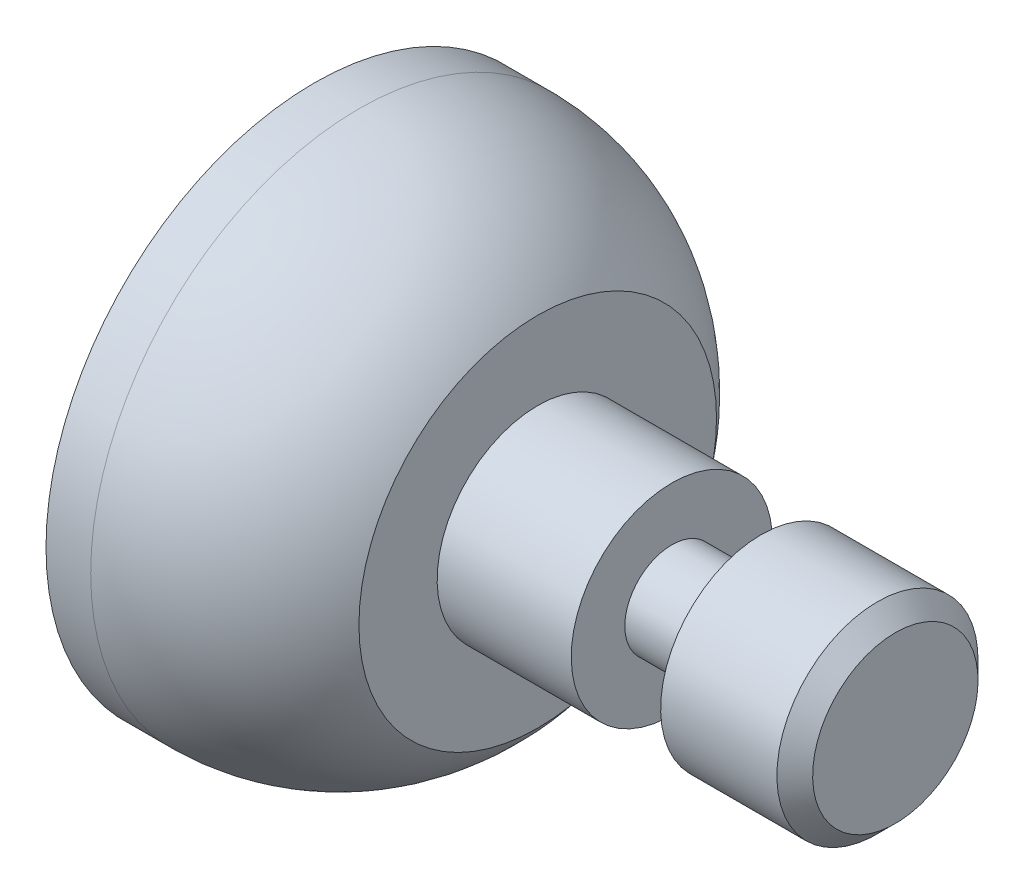
ISO-10303-21;
HEADER;
FILE_DESCRIPTION(('STEP AP214'),'2;1');
FILE_NAME('part.step','',(''),(''),'','','');
FILE_SCHEMA(('AUTOMOTIVE_DESIGN { 1 0 10303 214 1 1 1 1 }'));
ENDSEC;
DATA;
#1=APPLICATION_CONTEXT('core data for automotive mechanical design processes');
#2=APPLICATION_PROTOCOL_DEFINITION('international standard','automotive_design',2000,#1);
#3=PRODUCT_CONTEXT('',#1,'mechanical');
#4=PRODUCT('Part','Part','',(#3));
#5=PRODUCT_RELATED_PRODUCT_CATEGORY('part','',(#4));
#6=PRODUCT_DEFINITION_FORMATION('','',#4);
#7=PRODUCT_DEFINITION_CONTEXT('part definition',#1,'design');
#8=PRODUCT_DEFINITION('design','',#6,#7);
#9=PRODUCT_DEFINITION_SHAPE('','',#8);
#10=(LENGTH_UNIT() NAMED_UNIT(*) SI_UNIT(.MILLI.,.METRE.));
#11=(NAMED_UNIT(*) PLANE_ANGLE_UNIT() SI_UNIT($,.RADIAN.));
#12=(NAMED_UNIT(*) SI_UNIT($,.STERADIAN.) SOLID_ANGLE_UNIT());
#13=UNCERTAINTY_MEASURE_WITH_UNIT(LENGTH_MEASURE(1.E-05),#10,'distance_accuracy_value','');
#14=(GEOMETRIC_REPRESENTATION_CONTEXT(3) GLOBAL_UNCERTAINTY_ASSIGNED_CONTEXT((#13)) GLOBAL_UNIT_ASSIGNED_CONTEXT((#10,
#11,#12)) REPRESENTATION_CONTEXT('',''));
#15=CARTESIAN_POINT('',(0.,0.,0.));
#16=DIRECTION('',(0.,0.,1.));
#17=DIRECTION('',(1.,0.,0.));
#18=AXIS2_PLACEMENT_3D('',#15,#16,#17);
#19=CARTESIAN_POINT('',(0.,0.,0.));
#20=DIRECTION('',(-1.,0.,0.));
#21=DIRECTION('',(0.,-1.,0.));
#22=AXIS2_PLACEMENT_3D('',#19,#20,#21);
#23=PLANE('',#22);
#24=CARTESIAN_POINT('',(0.,0.,0.));
#25=DIRECTION('',(1.,0.,0.));
#26=DIRECTION('',(0.,1.,0.));
#27=AXIS2_PLACEMENT_3D('',#24,#25,#26);
#28=CIRCLE('',#27,19.05);
#29=CARTESIAN_POINT('',(0.,19.05,0.));
#30=VERTEX_POINT('',#29);
#31=EDGE_CURVE('E45',#30,#30,#28,.T.);
#32=ORIENTED_EDGE('',*,*,#31,.F.);
#33=EDGE_LOOP('',(#32));
#34=FACE_BOUND('',#33,.T.);
#35=ADVANCED_FACE('F33',(#34),#23,.T.);
#36=CARTESIAN_POINT('',(41.275,0.,0.));
#37=DIRECTION('',(1.,0.,0.));
#38=DIRECTION('',(0.,1.,0.));
#39=AXIS2_PLACEMENT_3D('',#36,#37,#38);
#40=CYLINDRICAL_SURFACE('',#39,19.05);
#41=ORIENTED_EDGE('',*,*,#31,.T.);
#42=EDGE_LOOP('',(#41));
#43=FACE_BOUND('',#42,.T.);
#44=CARTESIAN_POINT('',(3.175,0.,0.));
#45=DIRECTION('',(1.,0.,0.));
#46=DIRECTION('',(0.,1.,0.));
#47=AXIS2_PLACEMENT_3D('',#44,#45,#46);
#48=CIRCLE('',#47,19.05);
#49=CARTESIAN_POINT('',(3.175,19.05,0.));
#50=VERTEX_POINT('',#49);
#51=EDGE_CURVE('E49',#50,#50,#48,.T.);
#52=ORIENTED_EDGE('',*,*,#51,.F.);
#53=EDGE_LOOP('',(#52));
#54=FACE_BOUND('',#53,.T.);
#55=ADVANCED_FACE('F90',(#43,#54),#40,.T.);
#56=CARTESIAN_POINT('',(3.175,0.,0.));
#57=DIRECTION('',(1.,0.,0.));
#58=DIRECTION('',(0.,1.,0.));
#59=AXIS2_PLACEMENT_3D('',#56,#57,#58);
#60=DEGENERATE_TOROIDAL_SURFACE('',#59,3.175,15.875,.T.);
#61=ORIENTED_EDGE('',*,*,#51,.T.);
#62=EDGE_LOOP('',(#61));
#63=FACE_BOUND('',#62,.T.);
#64=CARTESIAN_POINT('',(15.875,0.,0.));
#65=DIRECTION('',(1.,0.,0.));
#66=DIRECTION('',(0.,1.,0.));
#67=AXIS2_PLACEMENT_3D('',#64,#65,#66);
#68=CIRCLE('',#67,12.7);
#69=CARTESIAN_POINT('',(15.875,12.7,0.));
#70=VERTEX_POINT('',#69);
#71=EDGE_CURVE('E54',#70,#70,#68,.T.);
#72=ORIENTED_EDGE('',*,*,#71,.F.);
#73=EDGE_LOOP('',(#72));
#74=FACE_BOUND('',#73,.T.);
#75=ADVANCED_FACE('F95',(#63,#74),#60,.T.);
#76=CARTESIAN_POINT('',(15.875,12.7,0.));
#77=DIRECTION('',(1.,0.,0.));
#78=DIRECTION('',(0.,1.,0.));
#79=AXIS2_PLACEMENT_3D('',#76,#77,#78);
#80=PLANE('',#79);
#81=ORIENTED_EDGE('',*,*,#71,.T.);
#82=EDGE_LOOP('',(#81));
#83=FACE_BOUND('',#82,.T.);
#84=CARTESIAN_POINT('',(15.875,0.,0.));
#85=DIRECTION('',(1.,0.,0.));
#86=DIRECTION('',(0.,1.,0.));
#87=AXIS2_PLACEMENT_3D('',#84,#85,#86);
#88=CIRCLE('',#87,7.14375);
#89=CARTESIAN_POINT('',(15.875,7.14375,0.));
#90=VERTEX_POINT('',#89);
#91=EDGE_CURVE('E57',#90,#90,#88,.T.);
#92=ORIENTED_EDGE('',*,*,#91,.F.);
#93=EDGE_LOOP('',(#92));
#94=FACE_BOUND('',#93,.T.);
#95=ADVANCED_FACE('F102',(#83,#94),#80,.T.);
#96=CARTESIAN_POINT('',(41.275,0.,0.));
#97=DIRECTION('',(1.,0.,0.));
#98=DIRECTION('',(0.,1.,0.));
#99=AXIS2_PLACEMENT_3D('',#96,#97,#98);
#100=CYLINDRICAL_SURFACE('',#99,7.14375);
#101=ORIENTED_EDGE('',*,*,#91,.T.);
#102=EDGE_LOOP('',(#101));
#103=FACE_BOUND('',#102,.T.);
#104=CARTESIAN_POINT('',(25.4,0.,0.));
#105=DIRECTION('',(1.,0.,0.));
#106=DIRECTION('',(0.,1.,0.));
#107=AXIS2_PLACEMENT_3D('',#104,#105,#106);
#108=CIRCLE('',#107,7.14375);
#109=CARTESIAN_POINT('',(25.4,7.14375,0.));
#110=VERTEX_POINT('',#109);
#111=EDGE_CURVE('E60',#110,#110,#108,.T.);
#112=ORIENTED_EDGE('',*,*,#111,.F.);
#113=EDGE_LOOP('',(#112));
#114=FACE_BOUND('',#113,.T.);
#115=ADVANCED_FACE('F106',(#103,#114),#100,.T.);
#116=CARTESIAN_POINT('',(25.4,7.14375,0.));
#117=DIRECTION('',(1.,0.,0.));
#118=DIRECTION('',(0.,1.,0.));
#119=AXIS2_PLACEMENT_3D('',#116,#117,#118);
#120=PLANE('',#119);
#121=ORIENTED_EDGE('',*,*,#111,.T.);
#122=EDGE_LOOP('',(#121));
#123=FACE_BOUND('',#122,.T.);
#124=CARTESIAN_POINT('',(25.4,0.,0.));
#125=DIRECTION('',(1.,0.,0.));
#126=DIRECTION('',(0.,1.,0.));
#127=AXIS2_PLACEMENT_3D('',#124,#125,#126);
#128=CIRCLE('',#127,3.3401);
#129=CARTESIAN_POINT('',(25.4,3.3401,0.));
#130=VERTEX_POINT('',#129);
#131=EDGE_CURVE('E63',#130,#130,#128,.T.);
#132=ORIENTED_EDGE('',*,*,#131,.F.);
#133=EDGE_LOOP('',(#132));
#134=FACE_BOUND('',#133,.T.);
#135=ADVANCED_FACE('F86',(#123,#134),#120,.T.);
#136=CARTESIAN_POINT('',(41.275,0.,0.));
#137=DIRECTION('',(1.,0.,0.));
#138=DIRECTION('',(0.,1.,0.));
#139=AXIS2_PLACEMENT_3D('',#136,#137,#138);
#140=CYLINDRICAL_SURFACE('',#139,3.3401);
#141=ORIENTED_EDGE('',*,*,#131,.T.);
#142=EDGE_LOOP('',(#141));
#143=FACE_BOUND('',#142,.T.);
#144=CARTESIAN_POINT('',(31.75,0.,0.));
#145=DIRECTION('',(1.,0.,0.));
#146=DIRECTION('',(0.,1.,0.));
#147=AXIS2_PLACEMENT_3D('',#144,#145,#146);
#148=CIRCLE('',#147,3.3401);
#149=CARTESIAN_POINT('',(31.75,3.3401,0.));
#150=VERTEX_POINT('',#149);
#151=EDGE_CURVE('E66',#150,#150,#148,.T.);
#152=ORIENTED_EDGE('',*,*,#151,.F.);
#153=EDGE_LOOP('',(#152));
#154=FACE_BOUND('',#153,.T.);
#155=ADVANCED_FACE('F77',(#143,#154),#140,.T.);
#156=CARTESIAN_POINT('',(31.75,3.3401,0.));
#157=DIRECTION('',(-1.,0.,0.));
#158=DIRECTION('',(0.,-1.,0.));
#159=AXIS2_PLACEMENT_3D('',#156,#157,#158);
#160=PLANE('',#159);
#161=ORIENTED_EDGE('',*,*,#151,.T.);
#162=EDGE_LOOP('',(#161));
#163=FACE_BOUND('',#162,.T.);
#164=CARTESIAN_POINT('',(31.75,0.,0.));
#165=DIRECTION('',(1.,0.,0.));
#166=DIRECTION('',(0.,1.,0.));
#167=AXIS2_PLACEMENT_3D('',#164,#165,#166);
#168=CIRCLE('',#167,7.14375);
#169=CARTESIAN_POINT('',(31.75,7.14375,0.));
#170=VERTEX_POINT('',#169);
#171=EDGE_CURVE('E69',#170,#170,#168,.T.);
#172=ORIENTED_EDGE('',*,*,#171,.F.);
#173=EDGE_LOOP('',(#172));
#174=FACE_BOUND('',#173,.T.);
#175=ADVANCED_FACE('F75',(#163,#174),#160,.T.);
#176=CARTESIAN_POINT('',(41.275,0.,0.));
#177=DIRECTION('',(1.,0.,0.));
#178=DIRECTION('',(0.,1.,0.));
#179=AXIS2_PLACEMENT_3D('',#176,#177,#178);
#180=CYLINDRICAL_SURFACE('',#179,7.14375);
#181=CARTESIAN_POINT('',(40.005,0.,0.));
#182=DIRECTION('',(1.,0.,0.));
#183=DIRECTION('',(0.,1.,0.));
#184=AXIS2_PLACEMENT_3D('',#181,#182,#183);
#185=CIRCLE('',#184,7.14375);
#186=CARTESIAN_POINT('',(40.005,7.14375,0.));
#187=VERTEX_POINT('',#186);
#188=EDGE_CURVE('E10',#187,#187,#185,.F.);
#189=ORIENTED_EDGE('',*,*,#188,.T.);
#190=EDGE_LOOP('',(#189));
#191=FACE_BOUND('',#190,.T.);
#192=ORIENTED_EDGE('',*,*,#171,.T.);
#193=EDGE_LOOP('',(#192));
#194=FACE_BOUND('',#193,.T.);
#195=ADVANCED_FACE('F73',(#191,#194),#180,.T.);
#196=CARTESIAN_POINT('',(41.275,7.14375,0.));
#197=DIRECTION('',(1.,0.,0.));
#198=DIRECTION('',(0.,1.,0.));
#199=AXIS2_PLACEMENT_3D('',#196,#197,#198);
#200=PLANE('',#199);
#201=CARTESIAN_POINT('',(41.275,0.,0.));
#202=DIRECTION('',(1.,0.,0.));
#203=DIRECTION('',(0.,1.,0.));
#204=AXIS2_PLACEMENT_3D('',#201,#202,#203);
#205=CIRCLE('',#204,5.87375);
#206=CARTESIAN_POINT('',(41.275,5.87375,0.));
#207=VERTEX_POINT('',#206);
#208=EDGE_CURVE('E41',#207,#207,#205,.T.);
#209=ORIENTED_EDGE('',*,*,#208,.T.);
#210=EDGE_LOOP('',(#209));
#211=FACE_BOUND('',#210,.T.);
#212=ADVANCED_FACE('F84',(#211),#200,.T.);
#213=CARTESIAN_POINT('',(41.275,0.,0.));
#214=DIRECTION('',(-1.,0.,0.));
#215=DIRECTION('',(0.,-1.,0.));
#216=AXIS2_PLACEMENT_3D('',#213,#214,#215);
#217=CONICAL_SURFACE('',#216,5.87375,0.78539816339745);
#218=ORIENTED_EDGE('',*,*,#188,.F.);
#219=EDGE_LOOP('',(#218));
#220=FACE_BOUND('',#219,.T.);
#221=ORIENTED_EDGE('',*,*,#208,.F.);
#222=EDGE_LOOP('',(#221));
#223=FACE_BOUND('',#222,.T.);
#224=ADVANCED_FACE('F36',(#220,#223),#217,.T.);
#225=CLOSED_SHELL('',(#35,#55,#75,#95,#115,#135,#155,#175,#195,#212,#224));
#226=MANIFOLD_SOLID_BREP('B2',#225);
#227=ADVANCED_BREP_SHAPE_REPRESENTATION('',(#18,#226),#14);
#228=SHAPE_DEFINITION_REPRESENTATION(#9,#227);
ENDSEC;
END-ISO-10303-21;
